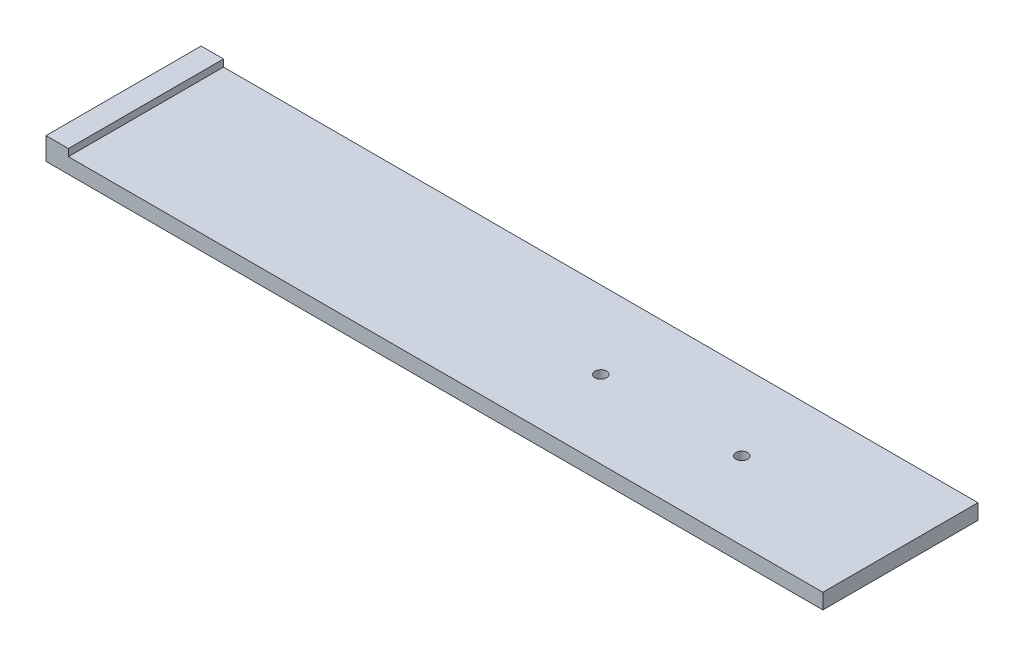
ISO-10303-21;
HEADER;
FILE_DESCRIPTION(('STEP AP214'),'2;1');
FILE_NAME('part.step','',(''),(''),'','','');
FILE_SCHEMA(('AUTOMOTIVE_DESIGN { 1 0 10303 214 1 1 1 1 }'));
ENDSEC;
DATA;
#1=APPLICATION_CONTEXT('core data for automotive mechanical design processes');
#2=APPLICATION_PROTOCOL_DEFINITION('international standard','automotive_design',2000,#1);
#3=PRODUCT_CONTEXT('',#1,'mechanical');
#4=PRODUCT('Part','Part','',(#3));
#5=PRODUCT_RELATED_PRODUCT_CATEGORY('part','',(#4));
#6=PRODUCT_DEFINITION_FORMATION('','',#4);
#7=PRODUCT_DEFINITION_CONTEXT('part definition',#1,'design');
#8=PRODUCT_DEFINITION('design','',#6,#7);
#9=PRODUCT_DEFINITION_SHAPE('','',#8);
#10=(LENGTH_UNIT() NAMED_UNIT(*) SI_UNIT(.MILLI.,.METRE.));
#11=(NAMED_UNIT(*) PLANE_ANGLE_UNIT() SI_UNIT($,.RADIAN.));
#12=(NAMED_UNIT(*) SI_UNIT($,.STERADIAN.) SOLID_ANGLE_UNIT());
#13=UNCERTAINTY_MEASURE_WITH_UNIT(LENGTH_MEASURE(1.E-05),#10,'distance_accuracy_value','');
#14=(GEOMETRIC_REPRESENTATION_CONTEXT(3) GLOBAL_UNCERTAINTY_ASSIGNED_CONTEXT((#13)) GLOBAL_UNIT_ASSIGNED_CONTEXT((#10,
#11,#12)) REPRESENTATION_CONTEXT('',''));
#15=CARTESIAN_POINT('',(0.,0.,0.));
#16=DIRECTION('',(0.,0.,1.));
#17=DIRECTION('',(1.,0.,0.));
#18=AXIS2_PLACEMENT_3D('',#15,#16,#17);
#19=CARTESIAN_POINT('',(0.,4.35,0.));
#20=DIRECTION('',(0.,-1.,0.));
#21=DIRECTION('',(0.,0.,-1.));
#22=AXIS2_PLACEMENT_3D('',#19,#20,#21);
#23=PLANE('',#22);
#24=CARTESIAN_POINT('',(135.35,4.35,-22.));
#25=DIRECTION('',(0.,1.,0.));
#26=DIRECTION('',(0.,0.,1.));
#27=AXIS2_PLACEMENT_3D('',#24,#25,#26);
#28=CIRCLE('',#27,1.64999999999998);
#29=CARTESIAN_POINT('',(135.35,4.35,-20.35));
#30=VERTEX_POINT('',#29);
#31=EDGE_CURVE('E296',#30,#30,#28,.T.);
#32=ORIENTED_EDGE('',*,*,#31,.F.);
#33=EDGE_LOOP('',(#32));
#34=FACE_BOUND('',#33,.T.);
#35=CARTESIAN_POINT('',(175.35,4.35,-22.));
#36=DIRECTION('',(0.,1.,0.));
#37=DIRECTION('',(0.,0.,1.));
#38=AXIS2_PLACEMENT_3D('',#35,#36,#37);
#39=CIRCLE('',#38,1.64999999999998);
#40=CARTESIAN_POINT('',(175.35,4.35,-20.35));
#41=VERTEX_POINT('',#40);
#42=EDGE_CURVE('E300',#41,#41,#39,.T.);
#43=ORIENTED_EDGE('',*,*,#42,.F.);
#44=EDGE_LOOP('',(#43));
#45=FACE_BOUND('',#44,.T.);
#46=DIRECTION('',(0.,0.,-1.));
#47=VECTOR('',#46,1.);
#48=CARTESIAN_POINT('',(6.35,4.35,0.));
#49=LINE('',#48,#47);
#50=CARTESIAN_POINT('',(6.35,4.35,0.));
#51=VERTEX_POINT('',#50);
#52=CARTESIAN_POINT('',(6.35,4.35,-44.));
#53=VERTEX_POINT('',#52);
#54=EDGE_CURVE('E61',#51,#53,#49,.T.);
#55=ORIENTED_EDGE('',*,*,#54,.F.);
#56=DIRECTION('',(1.,0.,0.));
#57=VECTOR('',#56,1.);
#58=CARTESIAN_POINT('',(0.,4.35,0.));
#59=LINE('',#58,#57);
#60=CARTESIAN_POINT('',(220.35,4.35,0.));
#61=VERTEX_POINT('',#60);
#62=EDGE_CURVE('E99',#51,#61,#59,.T.);
#63=ORIENTED_EDGE('',*,*,#62,.T.);
#64=DIRECTION('',(0.,0.,-1.));
#65=VECTOR('',#64,1.);
#66=CARTESIAN_POINT('',(220.35,4.35,0.));
#67=LINE('',#66,#65);
#68=CARTESIAN_POINT('',(220.35,4.35,-44.));
#69=VERTEX_POINT('',#68);
#70=EDGE_CURVE('E67',#61,#69,#67,.T.);
#71=ORIENTED_EDGE('',*,*,#70,.T.);
#72=DIRECTION('',(-1.,0.,0.));
#73=VECTOR('',#72,1.);
#74=CARTESIAN_POINT('',(0.,4.35,-44.));
#75=LINE('',#74,#73);
#76=EDGE_CURVE('E110',#69,#53,#75,.T.);
#77=ORIENTED_EDGE('',*,*,#76,.T.);
#78=EDGE_LOOP('',(#55,#63,#71,#77));
#79=FACE_BOUND('',#78,.T.);
#80=ADVANCED_FACE('F45',(#34,#45,#79),#23,.F.);
#81=CARTESIAN_POINT('',(0.,4.35,0.));
#82=DIRECTION('',(1.,0.,0.));
#83=DIRECTION('',(0.,0.,-1.));
#84=AXIS2_PLACEMENT_3D('',#81,#82,#83);
#85=PLANE('',#84);
#86=DIRECTION('',(0.,0.,1.));
#87=VECTOR('',#86,1.);
#88=CARTESIAN_POINT('',(0.,0.,0.));
#89=LINE('',#88,#87);
#90=CARTESIAN_POINT('',(0.,0.,-44.));
#91=VERTEX_POINT('',#90);
#92=CARTESIAN_POINT('',(0.,0.,0.));
#93=VERTEX_POINT('',#92);
#94=EDGE_CURVE('E106',#91,#93,#89,.T.);
#95=ORIENTED_EDGE('',*,*,#94,.T.);
#96=DIRECTION('',(0.,-1.,0.));
#97=VECTOR('',#96,1.);
#98=CARTESIAN_POINT('',(0.,4.35,0.));
#99=LINE('',#98,#97);
#100=CARTESIAN_POINT('',(0.,6.35,0.));
#101=VERTEX_POINT('',#100);
#102=EDGE_CURVE('E11',#101,#93,#99,.T.);
#103=ORIENTED_EDGE('',*,*,#102,.F.);
#104=DIRECTION('',(0.,0.,1.));
#105=VECTOR('',#104,1.);
#106=CARTESIAN_POINT('',(0.,6.35,0.));
#107=LINE('',#106,#105);
#108=CARTESIAN_POINT('',(0.,6.35,-44.));
#109=VERTEX_POINT('',#108);
#110=EDGE_CURVE('E108',#109,#101,#107,.T.);
#111=ORIENTED_EDGE('',*,*,#110,.F.);
#112=DIRECTION('',(0.,-1.,0.));
#113=VECTOR('',#112,1.);
#114=CARTESIAN_POINT('',(0.,4.35,-44.));
#115=LINE('',#114,#113);
#116=EDGE_CURVE('E91',#109,#91,#115,.T.);
#117=ORIENTED_EDGE('',*,*,#116,.T.);
#118=EDGE_LOOP('',(#95,#103,#111,#117));
#119=FACE_BOUND('',#118,.T.);
#120=ADVANCED_FACE('F47',(#119),#85,.F.);
#121=CARTESIAN_POINT('',(0.,4.35,0.));
#122=DIRECTION('',(0.,0.,-1.));
#123=DIRECTION('',(-1.,0.,0.));
#124=AXIS2_PLACEMENT_3D('',#121,#122,#123);
#125=PLANE('',#124);
#126=DIRECTION('',(1.,0.,0.));
#127=VECTOR('',#126,1.);
#128=CARTESIAN_POINT('',(0.,0.,0.));
#129=LINE('',#128,#127);
#130=CARTESIAN_POINT('',(220.35,0.,0.));
#131=VERTEX_POINT('',#130);
#132=EDGE_CURVE('E113',#93,#131,#129,.T.);
#133=ORIENTED_EDGE('',*,*,#132,.T.);
#134=DIRECTION('',(0.,-1.,0.));
#135=VECTOR('',#134,1.);
#136=CARTESIAN_POINT('',(220.35,4.35,0.));
#137=LINE('',#136,#135);
#138=EDGE_CURVE('E54',#61,#131,#137,.T.);
#139=ORIENTED_EDGE('',*,*,#138,.F.);
#140=ORIENTED_EDGE('',*,*,#62,.F.);
#141=DIRECTION('',(0.,-1.,0.));
#142=VECTOR('',#141,1.);
#143=CARTESIAN_POINT('',(6.35,6.35,0.));
#144=LINE('',#143,#142);
#145=CARTESIAN_POINT('',(6.35,6.35,0.));
#146=VERTEX_POINT('',#145);
#147=EDGE_CURVE('E115',#146,#51,#144,.T.);
#148=ORIENTED_EDGE('',*,*,#147,.F.);
#149=DIRECTION('',(1.,0.,0.));
#150=VECTOR('',#149,1.);
#151=CARTESIAN_POINT('',(0.,6.35,0.));
#152=LINE('',#151,#150);
#153=EDGE_CURVE('E140',#101,#146,#152,.T.);
#154=ORIENTED_EDGE('',*,*,#153,.F.);
#155=ORIENTED_EDGE('',*,*,#102,.T.);
#156=EDGE_LOOP('',(#133,#139,#140,#148,#154,#155));
#157=FACE_BOUND('',#156,.T.);
#158=ADVANCED_FACE('F135',(#157),#125,.F.);
#159=CARTESIAN_POINT('',(220.35,4.35,0.));
#160=DIRECTION('',(-1.,0.,0.));
#161=DIRECTION('',(0.,0.,1.));
#162=AXIS2_PLACEMENT_3D('',#159,#160,#161);
#163=PLANE('',#162);
#164=DIRECTION('',(0.,0.,-1.));
#165=VECTOR('',#164,1.);
#166=CARTESIAN_POINT('',(220.35,0.,0.));
#167=LINE('',#166,#165);
#168=CARTESIAN_POINT('',(220.35,0.,-44.));
#169=VERTEX_POINT('',#168);
#170=EDGE_CURVE('E100',#131,#169,#167,.T.);
#171=ORIENTED_EDGE('',*,*,#170,.T.);
#172=DIRECTION('',(0.,-1.,0.));
#173=VECTOR('',#172,1.);
#174=CARTESIAN_POINT('',(220.35,4.35,-44.));
#175=LINE('',#174,#173);
#176=EDGE_CURVE('E94',#69,#169,#175,.T.);
#177=ORIENTED_EDGE('',*,*,#176,.F.);
#178=ORIENTED_EDGE('',*,*,#70,.F.);
#179=ORIENTED_EDGE('',*,*,#138,.T.);
#180=EDGE_LOOP('',(#171,#177,#178,#179));
#181=FACE_BOUND('',#180,.T.);
#182=ADVANCED_FACE('F133',(#181),#163,.F.);
#183=CARTESIAN_POINT('',(0.,4.35,-44.));
#184=DIRECTION('',(0.,0.,1.));
#185=DIRECTION('',(1.,0.,0.));
#186=AXIS2_PLACEMENT_3D('',#183,#184,#185);
#187=PLANE('',#186);
#188=DIRECTION('',(-1.,0.,0.));
#189=VECTOR('',#188,1.);
#190=CARTESIAN_POINT('',(0.,0.,-44.));
#191=LINE('',#190,#189);
#192=EDGE_CURVE('E87',#169,#91,#191,.T.);
#193=ORIENTED_EDGE('',*,*,#192,.T.);
#194=ORIENTED_EDGE('',*,*,#116,.F.);
#195=DIRECTION('',(-1.,0.,0.));
#196=VECTOR('',#195,1.);
#197=CARTESIAN_POINT('',(0.,6.35,-44.));
#198=LINE('',#197,#196);
#199=CARTESIAN_POINT('',(6.35,6.35,-44.));
#200=VERTEX_POINT('',#199);
#201=EDGE_CURVE('E154',#200,#109,#198,.T.);
#202=ORIENTED_EDGE('',*,*,#201,.F.);
#203=DIRECTION('',(0.,-1.,0.));
#204=VECTOR('',#203,1.);
#205=CARTESIAN_POINT('',(6.35,6.35,-44.));
#206=LINE('',#205,#204);
#207=EDGE_CURVE('E121',#200,#53,#206,.T.);
#208=ORIENTED_EDGE('',*,*,#207,.T.);
#209=ORIENTED_EDGE('',*,*,#76,.F.);
#210=ORIENTED_EDGE('',*,*,#176,.T.);
#211=EDGE_LOOP('',(#193,#194,#202,#208,#209,#210));
#212=FACE_BOUND('',#211,.T.);
#213=ADVANCED_FACE('F89',(#212),#187,.F.);
#214=CARTESIAN_POINT('',(0.,0.,0.));
#215=DIRECTION('',(0.,-1.,0.));
#216=DIRECTION('',(0.,0.,-1.));
#217=AXIS2_PLACEMENT_3D('',#214,#215,#216);
#218=PLANE('',#217);
#219=CARTESIAN_POINT('',(135.35,0.,-22.));
#220=DIRECTION('',(0.,1.,0.));
#221=DIRECTION('',(0.,0.,1.));
#222=AXIS2_PLACEMENT_3D('',#219,#220,#221);
#223=CIRCLE('',#222,1.64999999999998);
#224=CARTESIAN_POINT('',(135.35,0.,-20.35));
#225=VERTEX_POINT('',#224);
#226=EDGE_CURVE('E294',#225,#225,#223,.T.);
#227=ORIENTED_EDGE('',*,*,#226,.T.);
#228=EDGE_LOOP('',(#227));
#229=FACE_BOUND('',#228,.T.);
#230=CARTESIAN_POINT('',(175.35,0.,-22.));
#231=DIRECTION('',(0.,1.,0.));
#232=DIRECTION('',(0.,0.,1.));
#233=AXIS2_PLACEMENT_3D('',#230,#231,#232);
#234=CIRCLE('',#233,1.64999999999998);
#235=CARTESIAN_POINT('',(175.35,0.,-20.35));
#236=VERTEX_POINT('',#235);
#237=EDGE_CURVE('E167',#236,#236,#234,.T.);
#238=ORIENTED_EDGE('',*,*,#237,.T.);
#239=EDGE_LOOP('',(#238));
#240=FACE_BOUND('',#239,.T.);
#241=ORIENTED_EDGE('',*,*,#94,.F.);
#242=ORIENTED_EDGE('',*,*,#192,.F.);
#243=ORIENTED_EDGE('',*,*,#170,.F.);
#244=ORIENTED_EDGE('',*,*,#132,.F.);
#245=EDGE_LOOP('',(#241,#242,#243,#244));
#246=FACE_BOUND('',#245,.T.);
#247=ADVANCED_FACE('F112',(#229,#240,#246),#218,.T.);
#248=CARTESIAN_POINT('',(6.35,6.35,0.));
#249=DIRECTION('',(-1.,0.,0.));
#250=DIRECTION('',(0.,0.,1.));
#251=AXIS2_PLACEMENT_3D('',#248,#249,#250);
#252=PLANE('',#251);
#253=ORIENTED_EDGE('',*,*,#54,.T.);
#254=ORIENTED_EDGE('',*,*,#207,.F.);
#255=DIRECTION('',(0.,0.,-1.));
#256=VECTOR('',#255,1.);
#257=CARTESIAN_POINT('',(6.35,6.35,0.));
#258=LINE('',#257,#256);
#259=EDGE_CURVE('E151',#146,#200,#258,.T.);
#260=ORIENTED_EDGE('',*,*,#259,.F.);
#261=ORIENTED_EDGE('',*,*,#147,.T.);
#262=EDGE_LOOP('',(#253,#254,#260,#261));
#263=FACE_BOUND('',#262,.T.);
#264=ADVANCED_FACE('F159',(#263),#252,.F.);
#265=CARTESIAN_POINT('',(0.,6.35,0.));
#266=DIRECTION('',(0.,-1.,0.));
#267=DIRECTION('',(0.,0.,-1.));
#268=AXIS2_PLACEMENT_3D('',#265,#266,#267);
#269=PLANE('',#268);
#270=ORIENTED_EDGE('',*,*,#110,.T.);
#271=ORIENTED_EDGE('',*,*,#153,.T.);
#272=ORIENTED_EDGE('',*,*,#259,.T.);
#273=ORIENTED_EDGE('',*,*,#201,.T.);
#274=EDGE_LOOP('',(#270,#271,#272,#273));
#275=FACE_BOUND('',#274,.T.);
#276=ADVANCED_FACE('F153',(#275),#269,.F.);
#277=CARTESIAN_POINT('',(175.35,4.35,-22.));
#278=DIRECTION('',(0.,1.,0.));
#279=DIRECTION('',(0.,0.,1.));
#280=AXIS2_PLACEMENT_3D('',#277,#278,#279);
#281=CYLINDRICAL_SURFACE('',#280,1.64999999999998);
#282=ORIENTED_EDGE('',*,*,#237,.F.);
#283=EDGE_LOOP('',(#282));
#284=FACE_BOUND('',#283,.T.);
#285=ORIENTED_EDGE('',*,*,#42,.T.);
#286=EDGE_LOOP('',(#285));
#287=FACE_BOUND('',#286,.T.);
#288=ADVANCED_FACE('F218',(#284,#287),#281,.F.);
#289=CARTESIAN_POINT('',(135.35,4.35,-22.));
#290=DIRECTION('',(0.,1.,0.));
#291=DIRECTION('',(0.,0.,1.));
#292=AXIS2_PLACEMENT_3D('',#289,#290,#291);
#293=CYLINDRICAL_SURFACE('',#292,1.64999999999998);
#294=ORIENTED_EDGE('',*,*,#226,.F.);
#295=EDGE_LOOP('',(#294));
#296=FACE_BOUND('',#295,.T.);
#297=ORIENTED_EDGE('',*,*,#31,.T.);
#298=EDGE_LOOP('',(#297));
#299=FACE_BOUND('',#298,.T.);
#300=ADVANCED_FACE('F224',(#296,#299),#293,.F.);
#301=CLOSED_SHELL('',(#80,#120,#158,#182,#213,#247,#264,#276,#288,#300));
#302=MANIFOLD_SOLID_BREP('B2',#301);
#303=ADVANCED_BREP_SHAPE_REPRESENTATION('',(#18,#302),#14);
#304=SHAPE_DEFINITION_REPRESENTATION(#9,#303);
ENDSEC;
END-ISO-10303-21;
